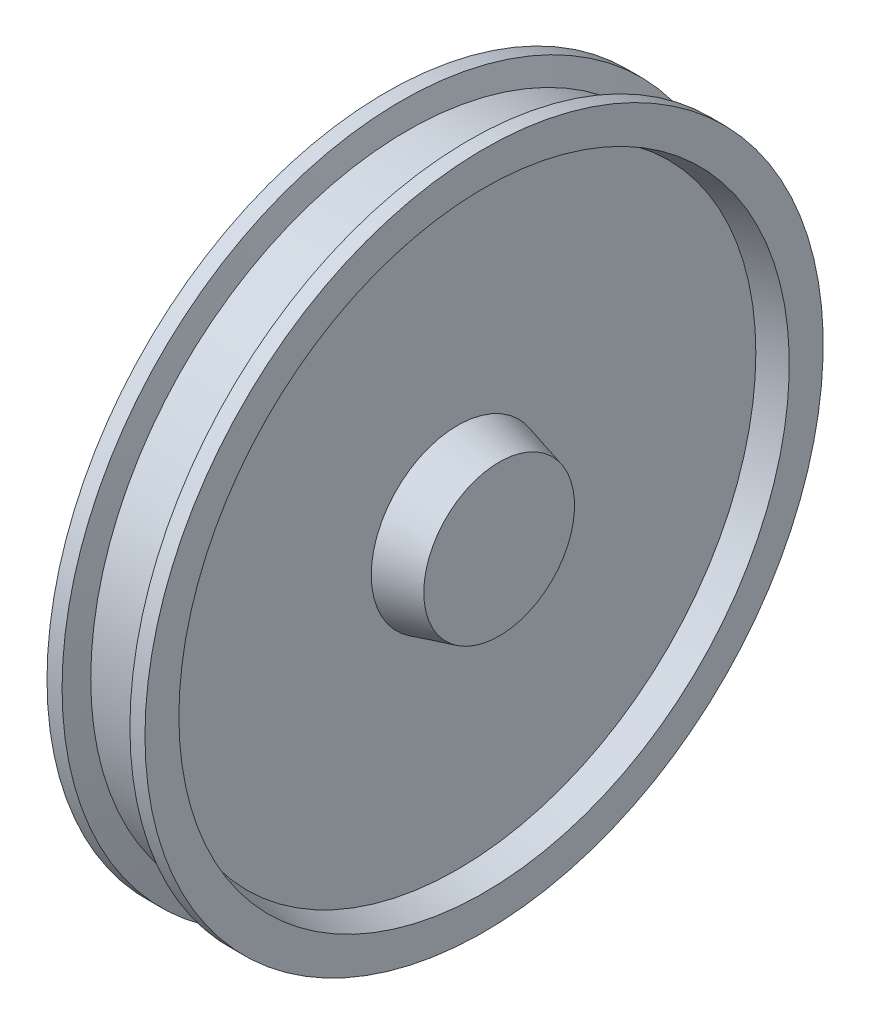
ISO-10303-21;
HEADER;
FILE_DESCRIPTION(('STEP AP214'),'2;1');
FILE_NAME('part.step','',(''),(''),'','','');
FILE_SCHEMA(('AUTOMOTIVE_DESIGN { 1 0 10303 214 1 1 1 1 }'));
ENDSEC;
DATA;
#1=APPLICATION_CONTEXT('core data for automotive mechanical design processes');
#2=APPLICATION_PROTOCOL_DEFINITION('international standard','automotive_design',2000,#1);
#3=PRODUCT_CONTEXT('',#1,'mechanical');
#4=PRODUCT('Part','Part','',(#3));
#5=PRODUCT_RELATED_PRODUCT_CATEGORY('part','',(#4));
#6=PRODUCT_DEFINITION_FORMATION('','',#4);
#7=PRODUCT_DEFINITION_CONTEXT('part definition',#1,'design');
#8=PRODUCT_DEFINITION('design','',#6,#7);
#9=PRODUCT_DEFINITION_SHAPE('','',#8);
#10=(LENGTH_UNIT() NAMED_UNIT(*) SI_UNIT(.MILLI.,.METRE.));
#11=(NAMED_UNIT(*) PLANE_ANGLE_UNIT() SI_UNIT($,.RADIAN.));
#12=(NAMED_UNIT(*) SI_UNIT($,.STERADIAN.) SOLID_ANGLE_UNIT());
#13=UNCERTAINTY_MEASURE_WITH_UNIT(LENGTH_MEASURE(1.E-05),#10,'distance_accuracy_value','');
#14=(GEOMETRIC_REPRESENTATION_CONTEXT(3) GLOBAL_UNCERTAINTY_ASSIGNED_CONTEXT((#13)) GLOBAL_UNIT_ASSIGNED_CONTEXT((#10,
#11,#12)) REPRESENTATION_CONTEXT('',''));
#15=CARTESIAN_POINT('',(0.,0.,0.));
#16=DIRECTION('',(0.,0.,1.));
#17=DIRECTION('',(1.,0.,0.));
#18=AXIS2_PLACEMENT_3D('',#15,#16,#17);
#19=CARTESIAN_POINT('',(85.,0.,0.));
#20=DIRECTION('',(-1.,0.,0.));
#21=DIRECTION('',(0.,0.,1.));
#22=AXIS2_PLACEMENT_3D('',#19,#20,#21);
#23=PLANE('',#22);
#24=CARTESIAN_POINT('',(85.,0.,0.));
#25=DIRECTION('',(-1.,0.,0.));
#26=DIRECTION('',(0.,0.,1.));
#27=AXIS2_PLACEMENT_3D('',#24,#25,#26);
#28=CIRCLE('',#27,100.);
#29=CARTESIAN_POINT('',(85.,0.,100.));
#30=VERTEX_POINT('',#29);
#31=EDGE_CURVE('E10',#30,#30,#28,.T.);
#32=ORIENTED_EDGE('',*,*,#31,.F.);
#33=EDGE_LOOP('',(#32));
#34=FACE_BOUND('',#33,.T.);
#35=ADVANCED_FACE('F41',(#34),#23,.F.);
#36=CARTESIAN_POINT('',(85.,0.,0.));
#37=DIRECTION('',(-1.,0.,0.));
#38=DIRECTION('',(0.,0.,1.));
#39=AXIS2_PLACEMENT_3D('',#36,#37,#38);
#40=CONICAL_SURFACE('',#39,100.,0.26179938779915);
#41=CARTESIAN_POINT('',(30.,0.,0.));
#42=DIRECTION('',(-1.,0.,0.));
#43=DIRECTION('',(0.,0.,1.));
#44=AXIS2_PLACEMENT_3D('',#41,#42,#43);
#45=CIRCLE('',#44,114.737205583712);
#46=CARTESIAN_POINT('',(30.,0.,114.737205583712));
#47=VERTEX_POINT('',#46);
#48=EDGE_CURVE('E48',#47,#47,#45,.T.);
#49=ORIENTED_EDGE('',*,*,#48,.F.);
#50=EDGE_LOOP('',(#49));
#51=FACE_BOUND('',#50,.T.);
#52=ORIENTED_EDGE('',*,*,#31,.T.);
#53=EDGE_LOOP('',(#52));
#54=FACE_BOUND('',#53,.T.);
#55=ADVANCED_FACE('F175',(#51,#54),#40,.T.);
#56=CARTESIAN_POINT('',(30.,114.737205583712,0.));
#57=DIRECTION('',(-1.,0.,0.));
#58=DIRECTION('',(0.,0.,1.));
#59=AXIS2_PLACEMENT_3D('',#56,#57,#58);
#60=PLANE('',#59);
#61=CARTESIAN_POINT('',(30.,0.,0.));
#62=DIRECTION('',(-1.,0.,0.));
#63=DIRECTION('',(0.,0.,1.));
#64=AXIS2_PLACEMENT_3D('',#61,#62,#63);
#65=CIRCLE('',#64,395.621778264911);
#66=CARTESIAN_POINT('',(30.,0.,395.621778264911));
#67=VERTEX_POINT('',#66);
#68=EDGE_CURVE('E53',#67,#67,#65,.T.);
#69=ORIENTED_EDGE('',*,*,#68,.F.);
#70=EDGE_LOOP('',(#69));
#71=FACE_BOUND('',#70,.T.);
#72=ORIENTED_EDGE('',*,*,#48,.T.);
#73=EDGE_LOOP('',(#72));
#74=FACE_BOUND('',#73,.T.);
#75=ADVANCED_FACE('F170',(#71,#74),#60,.F.);
#76=CARTESIAN_POINT('',(30.,0.,0.));
#77=DIRECTION('',(1.,0.,0.));
#78=DIRECTION('',(0.,0.,-1.));
#79=AXIS2_PLACEMENT_3D('',#76,#77,#78);
#80=CONICAL_SURFACE('',#79,395.621778264911,0.261799387799142);
#81=CARTESIAN_POINT('',(65.,0.,0.));
#82=DIRECTION('',(-1.,0.,0.));
#83=DIRECTION('',(0.,0.,1.));
#84=AXIS2_PLACEMENT_3D('',#81,#82,#83);
#85=CIRCLE('',#84,405.);
#86=CARTESIAN_POINT('',(65.,0.,405.));
#87=VERTEX_POINT('',#86);
#88=EDGE_CURVE('E58',#87,#87,#85,.T.);
#89=ORIENTED_EDGE('',*,*,#88,.F.);
#90=EDGE_LOOP('',(#89));
#91=FACE_BOUND('',#90,.T.);
#92=ORIENTED_EDGE('',*,*,#68,.T.);
#93=EDGE_LOOP('',(#92));
#94=FACE_BOUND('',#93,.T.);
#95=ADVANCED_FACE('F164',(#91,#94),#80,.F.);
#96=CARTESIAN_POINT('',(65.,405.,0.));
#97=DIRECTION('',(-1.,0.,0.));
#98=DIRECTION('',(0.,0.,1.));
#99=AXIS2_PLACEMENT_3D('',#96,#97,#98);
#100=PLANE('',#99);
#101=CARTESIAN_POINT('',(65.,0.,0.));
#102=DIRECTION('',(-1.,0.,0.));
#103=DIRECTION('',(0.,0.,1.));
#104=AXIS2_PLACEMENT_3D('',#101,#102,#103);
#105=CIRCLE('',#104,450.);
#106=CARTESIAN_POINT('',(65.,0.,450.));
#107=VERTEX_POINT('',#106);
#108=EDGE_CURVE('E64',#107,#107,#105,.T.);
#109=ORIENTED_EDGE('',*,*,#108,.F.);
#110=EDGE_LOOP('',(#109));
#111=FACE_BOUND('',#110,.T.);
#112=ORIENTED_EDGE('',*,*,#88,.T.);
#113=EDGE_LOOP('',(#112));
#114=FACE_BOUND('',#113,.T.);
#115=ADVANCED_FACE('F158',(#111,#114),#100,.F.);
#116=CARTESIAN_POINT('',(-85.,0.,0.));
#117=DIRECTION('',(-1.,0.,0.));
#118=DIRECTION('',(0.,0.,1.));
#119=AXIS2_PLACEMENT_3D('',#116,#117,#118);
#120=CYLINDRICAL_SURFACE('',#119,450.);
#121=CARTESIAN_POINT('',(45.,0.,0.));
#122=DIRECTION('',(-1.,0.,0.));
#123=DIRECTION('',(0.,0.,1.));
#124=AXIS2_PLACEMENT_3D('',#121,#122,#123);
#125=CIRCLE('',#124,450.);
#126=CARTESIAN_POINT('',(45.,0.,450.));
#127=VERTEX_POINT('',#126);
#128=EDGE_CURVE('E68',#127,#127,#125,.T.);
#129=ORIENTED_EDGE('',*,*,#128,.F.);
#130=EDGE_LOOP('',(#129));
#131=FACE_BOUND('',#130,.T.);
#132=ORIENTED_EDGE('',*,*,#108,.T.);
#133=EDGE_LOOP('',(#132));
#134=FACE_BOUND('',#133,.T.);
#135=ADVANCED_FACE('F152',(#131,#134),#120,.T.);
#136=CARTESIAN_POINT('',(45.,0.,0.));
#137=DIRECTION('',(1.,0.,0.));
#138=DIRECTION('',(0.,0.,-1.));
#139=AXIS2_PLACEMENT_3D('',#136,#137,#138);
#140=CONICAL_SURFACE('',#139,450.,1.30899693899575);
#141=CARTESIAN_POINT('',(36.9615242270663,0.,0.));
#142=DIRECTION('',(-1.,0.,0.));
#143=DIRECTION('',(0.,0.,1.));
#144=AXIS2_PLACEMENT_3D('',#141,#142,#143);
#145=CIRCLE('',#144,420.);
#146=CARTESIAN_POINT('',(36.9615242270663,0.,420.));
#147=VERTEX_POINT('',#146);
#148=EDGE_CURVE('E72',#147,#147,#145,.T.);
#149=ORIENTED_EDGE('',*,*,#148,.F.);
#150=EDGE_LOOP('',(#149));
#151=FACE_BOUND('',#150,.T.);
#152=ORIENTED_EDGE('',*,*,#128,.T.);
#153=EDGE_LOOP('',(#152));
#154=FACE_BOUND('',#153,.T.);
#155=ADVANCED_FACE('F146',(#151,#154),#140,.T.);
#156=CARTESIAN_POINT('',(-85.,0.,0.));
#157=DIRECTION('',(-1.,0.,0.));
#158=DIRECTION('',(0.,0.,1.));
#159=AXIS2_PLACEMENT_3D('',#156,#157,#158);
#160=CYLINDRICAL_SURFACE('',#159,420.);
#161=CARTESIAN_POINT('',(-36.9615242270663,0.,0.));
#162=DIRECTION('',(-1.,0.,0.));
#163=DIRECTION('',(0.,0.,1.));
#164=AXIS2_PLACEMENT_3D('',#161,#162,#163);
#165=CIRCLE('',#164,420.);
#166=CARTESIAN_POINT('',(-36.9615242270663,0.,420.));
#167=VERTEX_POINT('',#166);
#168=EDGE_CURVE('E76',#167,#167,#165,.T.);
#169=ORIENTED_EDGE('',*,*,#168,.F.);
#170=EDGE_LOOP('',(#169));
#171=FACE_BOUND('',#170,.T.);
#172=ORIENTED_EDGE('',*,*,#148,.T.);
#173=EDGE_LOOP('',(#172));
#174=FACE_BOUND('',#173,.T.);
#175=ADVANCED_FACE('F140',(#171,#174),#160,.T.);
#176=CARTESIAN_POINT('',(-36.9615242270663,0.,0.));
#177=DIRECTION('',(-1.,0.,0.));
#178=DIRECTION('',(0.,0.,1.));
#179=AXIS2_PLACEMENT_3D('',#176,#177,#178);
#180=CONICAL_SURFACE('',#179,420.,1.30899693899575);
#181=CARTESIAN_POINT('',(-45.,0.,0.));
#182=DIRECTION('',(-1.,0.,0.));
#183=DIRECTION('',(0.,0.,1.));
#184=AXIS2_PLACEMENT_3D('',#181,#182,#183);
#185=CIRCLE('',#184,450.);
#186=CARTESIAN_POINT('',(-45.,0.,450.));
#187=VERTEX_POINT('',#186);
#188=EDGE_CURVE('E80',#187,#187,#185,.T.);
#189=ORIENTED_EDGE('',*,*,#188,.F.);
#190=EDGE_LOOP('',(#189));
#191=FACE_BOUND('',#190,.T.);
#192=ORIENTED_EDGE('',*,*,#168,.T.);
#193=EDGE_LOOP('',(#192));
#194=FACE_BOUND('',#193,.T.);
#195=ADVANCED_FACE('F134',(#191,#194),#180,.T.);
#196=CARTESIAN_POINT('',(-85.,0.,0.));
#197=DIRECTION('',(-1.,0.,0.));
#198=DIRECTION('',(0.,0.,1.));
#199=AXIS2_PLACEMENT_3D('',#196,#197,#198);
#200=CYLINDRICAL_SURFACE('',#199,450.);
#201=CARTESIAN_POINT('',(-65.,0.,0.));
#202=DIRECTION('',(-1.,0.,0.));
#203=DIRECTION('',(0.,0.,1.));
#204=AXIS2_PLACEMENT_3D('',#201,#202,#203);
#205=CIRCLE('',#204,450.);
#206=CARTESIAN_POINT('',(-65.,0.,450.));
#207=VERTEX_POINT('',#206);
#208=EDGE_CURVE('E84',#207,#207,#205,.T.);
#209=ORIENTED_EDGE('',*,*,#208,.F.);
#210=EDGE_LOOP('',(#209));
#211=FACE_BOUND('',#210,.T.);
#212=ORIENTED_EDGE('',*,*,#188,.T.);
#213=EDGE_LOOP('',(#212));
#214=FACE_BOUND('',#213,.T.);
#215=ADVANCED_FACE('F128',(#211,#214),#200,.T.);
#216=CARTESIAN_POINT('',(-65.,405.,0.));
#217=DIRECTION('',(1.,0.,0.));
#218=DIRECTION('',(0.,0.,-1.));
#219=AXIS2_PLACEMENT_3D('',#216,#217,#218);
#220=PLANE('',#219);
#221=CARTESIAN_POINT('',(-65.,0.,0.));
#222=DIRECTION('',(-1.,0.,0.));
#223=DIRECTION('',(0.,0.,1.));
#224=AXIS2_PLACEMENT_3D('',#221,#222,#223);
#225=CIRCLE('',#224,405.);
#226=CARTESIAN_POINT('',(-65.,0.,405.));
#227=VERTEX_POINT('',#226);
#228=EDGE_CURVE('E88',#227,#227,#225,.T.);
#229=ORIENTED_EDGE('',*,*,#228,.F.);
#230=EDGE_LOOP('',(#229));
#231=FACE_BOUND('',#230,.T.);
#232=ORIENTED_EDGE('',*,*,#208,.T.);
#233=EDGE_LOOP('',(#232));
#234=FACE_BOUND('',#233,.T.);
#235=ADVANCED_FACE('F122',(#231,#234),#220,.F.);
#236=CARTESIAN_POINT('',(-65.,0.,0.));
#237=DIRECTION('',(-1.,0.,0.));
#238=DIRECTION('',(0.,0.,1.));
#239=AXIS2_PLACEMENT_3D('',#236,#237,#238);
#240=CONICAL_SURFACE('',#239,405.,0.261799387799142);
#241=CARTESIAN_POINT('',(-30.,0.,0.));
#242=DIRECTION('',(-1.,0.,0.));
#243=DIRECTION('',(0.,0.,1.));
#244=AXIS2_PLACEMENT_3D('',#241,#242,#243);
#245=CIRCLE('',#244,395.621778264911);
#246=CARTESIAN_POINT('',(-30.,0.,395.621778264911));
#247=VERTEX_POINT('',#246);
#248=EDGE_CURVE('E92',#247,#247,#245,.T.);
#249=ORIENTED_EDGE('',*,*,#248,.F.);
#250=EDGE_LOOP('',(#249));
#251=FACE_BOUND('',#250,.T.);
#252=ORIENTED_EDGE('',*,*,#228,.T.);
#253=EDGE_LOOP('',(#252));
#254=FACE_BOUND('',#253,.T.);
#255=ADVANCED_FACE('F116',(#251,#254),#240,.F.);
#256=CARTESIAN_POINT('',(-30.,114.737205583712,0.));
#257=DIRECTION('',(1.,0.,0.));
#258=DIRECTION('',(0.,0.,-1.));
#259=AXIS2_PLACEMENT_3D('',#256,#257,#258);
#260=PLANE('',#259);
#261=CARTESIAN_POINT('',(-30.,0.,0.));
#262=DIRECTION('',(-1.,0.,0.));
#263=DIRECTION('',(0.,0.,1.));
#264=AXIS2_PLACEMENT_3D('',#261,#262,#263);
#265=CIRCLE('',#264,114.737205583712);
#266=CARTESIAN_POINT('',(-30.,0.,114.737205583712));
#267=VERTEX_POINT('',#266);
#268=EDGE_CURVE('E96',#267,#267,#265,.T.);
#269=ORIENTED_EDGE('',*,*,#268,.F.);
#270=EDGE_LOOP('',(#269));
#271=FACE_BOUND('',#270,.T.);
#272=ORIENTED_EDGE('',*,*,#248,.T.);
#273=EDGE_LOOP('',(#272));
#274=FACE_BOUND('',#273,.T.);
#275=ADVANCED_FACE('F110',(#271,#274),#260,.F.);
#276=CARTESIAN_POINT('',(-30.,0.,0.));
#277=DIRECTION('',(1.,0.,0.));
#278=DIRECTION('',(0.,0.,-1.));
#279=AXIS2_PLACEMENT_3D('',#276,#277,#278);
#280=CONICAL_SURFACE('',#279,114.737205583712,0.26179938779915);
#281=CARTESIAN_POINT('',(-85.,0.,0.));
#282=DIRECTION('',(-1.,0.,0.));
#283=DIRECTION('',(0.,0.,1.));
#284=AXIS2_PLACEMENT_3D('',#281,#282,#283);
#285=CIRCLE('',#284,100.);
#286=CARTESIAN_POINT('',(-85.,0.,100.));
#287=VERTEX_POINT('',#286);
#288=EDGE_CURVE('E100',#287,#287,#285,.T.);
#289=ORIENTED_EDGE('',*,*,#288,.F.);
#290=EDGE_LOOP('',(#289));
#291=FACE_BOUND('',#290,.T.);
#292=ORIENTED_EDGE('',*,*,#268,.T.);
#293=EDGE_LOOP('',(#292));
#294=FACE_BOUND('',#293,.T.);
#295=ADVANCED_FACE('F107',(#291,#294),#280,.T.);
#296=CARTESIAN_POINT('',(-85.,0.,0.));
#297=DIRECTION('',(1.,0.,0.));
#298=DIRECTION('',(0.,0.,-1.));
#299=AXIS2_PLACEMENT_3D('',#296,#297,#298);
#300=PLANE('',#299);
#301=ORIENTED_EDGE('',*,*,#288,.T.);
#302=EDGE_LOOP('',(#301));
#303=FACE_BOUND('',#302,.T.);
#304=ADVANCED_FACE('F105',(#303),#300,.F.);
#305=CLOSED_SHELL('',(#35,#55,#75,#95,#115,#135,#155,#175,#195,#215,#235,#255,#275,#295,#304));
#306=MANIFOLD_SOLID_BREP('B2',#305);
#307=ADVANCED_BREP_SHAPE_REPRESENTATION('',(#18,#306),#14);
#308=SHAPE_DEFINITION_REPRESENTATION(#9,#307);
ENDSEC;
END-ISO-10303-21;
